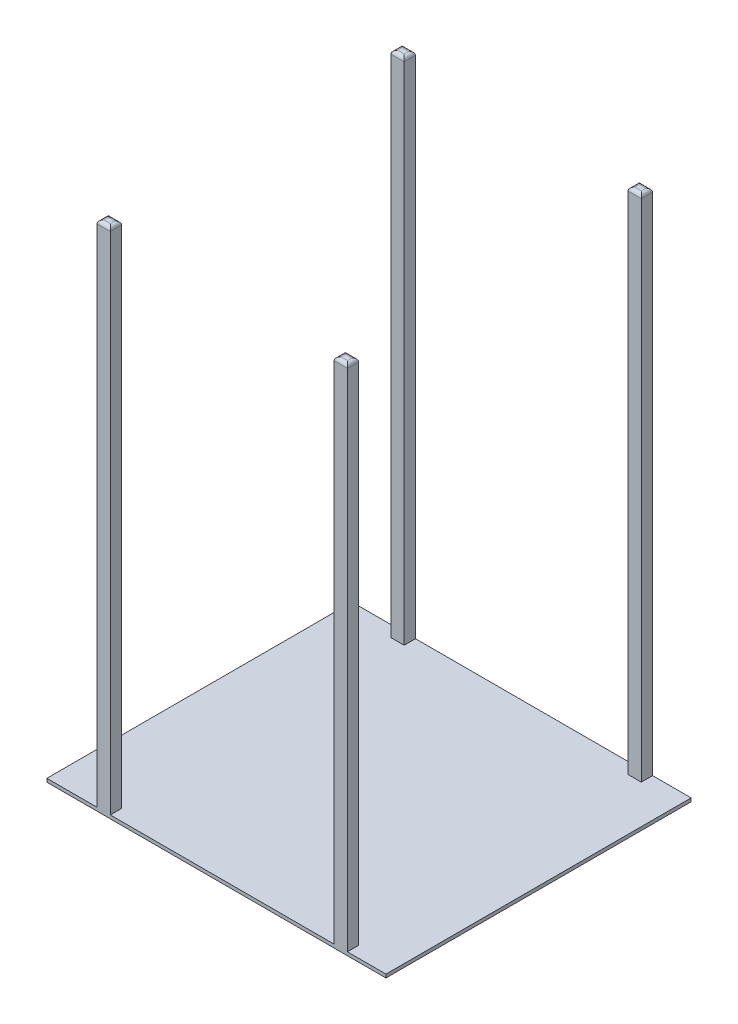
ISO-10303-21;
HEADER;
FILE_DESCRIPTION(('STEP AP214'),'2;1');
FILE_NAME('part.step','',(''),(''),'','','');
FILE_SCHEMA(('AUTOMOTIVE_DESIGN { 1 0 10303 214 1 1 1 1 }'));
ENDSEC;
DATA;
#1=APPLICATION_CONTEXT('core data for automotive mechanical design processes');
#2=APPLICATION_PROTOCOL_DEFINITION('international standard','automotive_design',2000,#1);
#3=PRODUCT_CONTEXT('',#1,'mechanical');
#4=PRODUCT('Part','Part','',(#3));
#5=PRODUCT_RELATED_PRODUCT_CATEGORY('part','',(#4));
#6=PRODUCT_DEFINITION_FORMATION('','',#4);
#7=PRODUCT_DEFINITION_CONTEXT('part definition',#1,'design');
#8=PRODUCT_DEFINITION('design','',#6,#7);
#9=PRODUCT_DEFINITION_SHAPE('','',#8);
#10=(LENGTH_UNIT() NAMED_UNIT(*) SI_UNIT(.MILLI.,.METRE.));
#11=(NAMED_UNIT(*) PLANE_ANGLE_UNIT() SI_UNIT($,.RADIAN.));
#12=(NAMED_UNIT(*) SI_UNIT($,.STERADIAN.) SOLID_ANGLE_UNIT());
#13=UNCERTAINTY_MEASURE_WITH_UNIT(LENGTH_MEASURE(1.E-05),#10,'distance_accuracy_value','');
#14=(GEOMETRIC_REPRESENTATION_CONTEXT(3) GLOBAL_UNCERTAINTY_ASSIGNED_CONTEXT((#13)) GLOBAL_UNIT_ASSIGNED_CONTEXT((#10,
#11,#12)) REPRESENTATION_CONTEXT('',''));
#15=CARTESIAN_POINT('',(0.,0.,0.));
#16=DIRECTION('',(0.,0.,1.));
#17=DIRECTION('',(1.,0.,0.));
#18=AXIS2_PLACEMENT_3D('',#15,#16,#17);
#19=CARTESIAN_POINT('',(0.,5.,0.));
#20=DIRECTION('',(0.,-1.,0.));
#21=DIRECTION('',(0.,0.,-1.));
#22=AXIS2_PLACEMENT_3D('',#19,#20,#21);
#23=PLANE('',#22);
#24=DIRECTION('',(0.,0.,1.));
#25=VECTOR('',#24,1.);
#26=CARTESIAN_POINT('',(-352.150315798933,5.,-450.));
#27=LINE('',#26,#25);
#28=CARTESIAN_POINT('',(-352.150315798933,5.,-450.));
#29=VERTEX_POINT('',#28);
#30=CARTESIAN_POINT('',(-352.150315798933,5.,-416.631011904762));
#31=VERTEX_POINT('',#30);
#32=EDGE_CURVE('E228',#29,#31,#27,.T.);
#33=ORIENTED_EDGE('',*,*,#32,.F.);
#34=DIRECTION('',(-1.,0.,0.));
#35=VECTOR('',#34,1.);
#36=CARTESIAN_POINT('',(-500.,5.,-450.));
#37=LINE('',#36,#35);
#38=CARTESIAN_POINT('',(-500.,5.,-450.));
#39=VERTEX_POINT('',#38);
#40=EDGE_CURVE('E236',#29,#39,#37,.T.);
#41=ORIENTED_EDGE('',*,*,#40,.T.);
#42=DIRECTION('',(0.,0.,1.));
#43=VECTOR('',#42,1.);
#44=CARTESIAN_POINT('',(-500.,5.,450.));
#45=LINE('',#44,#43);
#46=CARTESIAN_POINT('',(-500.,5.,450.));
#47=VERTEX_POINT('',#46);
#48=EDGE_CURVE('E312',#39,#47,#45,.T.);
#49=ORIENTED_EDGE('',*,*,#48,.T.);
#50=DIRECTION('',(1.,0.,0.));
#51=VECTOR('',#50,1.);
#52=CARTESIAN_POINT('',(-500.,5.,450.));
#53=LINE('',#52,#51);
#54=CARTESIAN_POINT('',(-352.150315798933,5.,450.));
#55=VERTEX_POINT('',#54);
#56=EDGE_CURVE('E315',#47,#55,#53,.T.);
#57=ORIENTED_EDGE('',*,*,#56,.T.);
#58=DIRECTION('',(0.,0.,1.));
#59=VECTOR('',#58,1.);
#60=CARTESIAN_POINT('',(-352.150315798933,5.,450.));
#61=LINE('',#60,#59);
#62=CARTESIAN_POINT('',(-352.150315798933,5.,416.631011904762));
#63=VERTEX_POINT('',#62);
#64=EDGE_CURVE('E290',#63,#55,#61,.T.);
#65=ORIENTED_EDGE('',*,*,#64,.F.);
#66=DIRECTION('',(-1.,0.,0.));
#67=VECTOR('',#66,1.);
#68=CARTESIAN_POINT('',(-352.150315798933,5.,416.631011904762));
#69=LINE('',#68,#67);
#70=CARTESIAN_POINT('',(-312.933324688853,5.,416.631011904762));
#71=VERTEX_POINT('',#70);
#72=EDGE_CURVE('E296',#71,#63,#69,.T.);
#73=ORIENTED_EDGE('',*,*,#72,.F.);
#74=DIRECTION('',(0.,0.,-1.));
#75=VECTOR('',#74,1.);
#76=CARTESIAN_POINT('',(-312.933324688853,5.,450.));
#77=LINE('',#76,#75);
#78=CARTESIAN_POINT('',(-312.933324688853,5.,450.));
#79=VERTEX_POINT('',#78);
#80=EDGE_CURVE('E293',#79,#71,#77,.T.);
#81=ORIENTED_EDGE('',*,*,#80,.F.);
#82=CARTESIAN_POINT('',(347.066675311147,5.,450.));
#83=VERTEX_POINT('',#82);
#84=EDGE_CURVE('E319',#79,#83,#53,.T.);
#85=ORIENTED_EDGE('',*,*,#84,.T.);
#86=DIRECTION('',(0.,0.,1.));
#87=VECTOR('',#86,1.);
#88=CARTESIAN_POINT('',(347.066675311147,5.,450.));
#89=LINE('',#88,#87);
#90=CARTESIAN_POINT('',(347.066675311147,5.,416.631011904762));
#91=VERTEX_POINT('',#90);
#92=EDGE_CURVE('E287',#91,#83,#89,.T.);
#93=ORIENTED_EDGE('',*,*,#92,.F.);
#94=DIRECTION('',(-1.,0.,0.));
#95=VECTOR('',#94,1.);
#96=CARTESIAN_POINT('',(347.066675311147,5.,416.631011904762));
#97=LINE('',#96,#95);
#98=CARTESIAN_POINT('',(386.283666421227,5.,416.631011904762));
#99=VERTEX_POINT('',#98);
#100=EDGE_CURVE('E281',#99,#91,#97,.T.);
#101=ORIENTED_EDGE('',*,*,#100,.F.);
#102=DIRECTION('',(0.,0.,-1.));
#103=VECTOR('',#102,1.);
#104=CARTESIAN_POINT('',(386.283666421227,5.,450.));
#105=LINE('',#104,#103);
#106=CARTESIAN_POINT('',(386.283666421227,5.,450.));
#107=VERTEX_POINT('',#106);
#108=EDGE_CURVE('E284',#107,#99,#105,.T.);
#109=ORIENTED_EDGE('',*,*,#108,.F.);
#110=CARTESIAN_POINT('',(500.,5.,450.));
#111=VERTEX_POINT('',#110);
#112=EDGE_CURVE('E314',#107,#111,#53,.T.);
#113=ORIENTED_EDGE('',*,*,#112,.T.);
#114=DIRECTION('',(0.,0.,-1.));
#115=VECTOR('',#114,1.);
#116=CARTESIAN_POINT('',(500.,5.,450.));
#117=LINE('',#116,#115);
#118=CARTESIAN_POINT('',(500.,5.,-450.));
#119=VERTEX_POINT('',#118);
#120=EDGE_CURVE('E244',#111,#119,#117,.T.);
#121=ORIENTED_EDGE('',*,*,#120,.T.);
#122=CARTESIAN_POINT('',(386.283666421227,5.,-450.));
#123=VERTEX_POINT('',#122);
#124=EDGE_CURVE('E246',#119,#123,#37,.T.);
#125=ORIENTED_EDGE('',*,*,#124,.T.);
#126=DIRECTION('',(0.,0.,-1.));
#127=VECTOR('',#126,1.);
#128=CARTESIAN_POINT('',(386.283666421227,5.,-450.));
#129=LINE('',#128,#127);
#130=CARTESIAN_POINT('',(386.283666421227,5.,-416.631011904762));
#131=VERTEX_POINT('',#130);
#132=EDGE_CURVE('E264',#131,#123,#129,.T.);
#133=ORIENTED_EDGE('',*,*,#132,.F.);
#134=DIRECTION('',(1.,0.,0.));
#135=VECTOR('',#134,1.);
#136=CARTESIAN_POINT('',(347.066675311147,5.,-416.631011904762));
#137=LINE('',#136,#135);
#138=CARTESIAN_POINT('',(347.066675311147,5.,-416.631011904762));
#139=VERTEX_POINT('',#138);
#140=EDGE_CURVE('E267',#139,#131,#137,.T.);
#141=ORIENTED_EDGE('',*,*,#140,.F.);
#142=DIRECTION('',(0.,0.,1.));
#143=VECTOR('',#142,1.);
#144=CARTESIAN_POINT('',(347.066675311147,5.,-450.));
#145=LINE('',#144,#143);
#146=CARTESIAN_POINT('',(347.066675311147,5.,-450.));
#147=VERTEX_POINT('',#146);
#148=EDGE_CURVE('E270',#147,#139,#145,.T.);
#149=ORIENTED_EDGE('',*,*,#148,.F.);
#150=CARTESIAN_POINT('',(-312.933324688853,5.,-450.));
#151=VERTEX_POINT('',#150);
#152=EDGE_CURVE('E243',#147,#151,#37,.T.);
#153=ORIENTED_EDGE('',*,*,#152,.T.);
#154=DIRECTION('',(0.,0.,-1.));
#155=VECTOR('',#154,1.);
#156=CARTESIAN_POINT('',(-312.933324688853,5.,-450.));
#157=LINE('',#156,#155);
#158=CARTESIAN_POINT('',(-312.933324688853,5.,-416.631011904762));
#159=VERTEX_POINT('',#158);
#160=EDGE_CURVE('E255',#159,#151,#157,.T.);
#161=ORIENTED_EDGE('',*,*,#160,.F.);
#162=DIRECTION('',(1.,0.,0.));
#163=VECTOR('',#162,1.);
#164=CARTESIAN_POINT('',(-352.150315798933,5.,-416.631011904762));
#165=LINE('',#164,#163);
#166=EDGE_CURVE('E250',#31,#159,#165,.T.);
#167=ORIENTED_EDGE('',*,*,#166,.F.);
#168=EDGE_LOOP('',(#33,#41,#49,#57,#65,#73,#81,#85,#93,#101,#109,#113,#121,#125,#133,#141,#149,
#153,#161,#167));
#169=FACE_BOUND('',#168,.T.);
#170=ADVANCED_FACE('F37',(#169),#23,.F.);
#171=CARTESIAN_POINT('',(500.,5.,450.));
#172=DIRECTION('',(-1.,0.,0.));
#173=DIRECTION('',(0.,0.,1.));
#174=AXIS2_PLACEMENT_3D('',#171,#172,#173);
#175=PLANE('',#174);
#176=DIRECTION('',(0.,0.,-1.));
#177=VECTOR('',#176,1.);
#178=CARTESIAN_POINT('',(500.,-5.,450.));
#179=LINE('',#178,#177);
#180=CARTESIAN_POINT('',(500.,-5.,450.));
#181=VERTEX_POINT('',#180);
#182=CARTESIAN_POINT('',(500.,-5.,-450.));
#183=VERTEX_POINT('',#182);
#184=EDGE_CURVE('E307',#181,#183,#179,.T.);
#185=ORIENTED_EDGE('',*,*,#184,.T.);
#186=DIRECTION('',(0.,-1.,0.));
#187=VECTOR('',#186,1.);
#188=CARTESIAN_POINT('',(500.,5.,-450.));
#189=LINE('',#188,#187);
#190=EDGE_CURVE('E333',#119,#183,#189,.T.);
#191=ORIENTED_EDGE('',*,*,#190,.F.);
#192=ORIENTED_EDGE('',*,*,#120,.F.);
#193=DIRECTION('',(0.,-1.,0.));
#194=VECTOR('',#193,1.);
#195=CARTESIAN_POINT('',(500.,5.,450.));
#196=LINE('',#195,#194);
#197=EDGE_CURVE('E318',#111,#181,#196,.T.);
#198=ORIENTED_EDGE('',*,*,#197,.T.);
#199=EDGE_LOOP('',(#185,#191,#192,#198));
#200=FACE_BOUND('',#199,.T.);
#201=ADVANCED_FACE('F477',(#200),#175,.F.);
#202=CARTESIAN_POINT('',(-500.,5.,-450.));
#203=DIRECTION('',(0.,0.,1.));
#204=DIRECTION('',(1.,0.,0.));
#205=AXIS2_PLACEMENT_3D('',#202,#203,#204);
#206=PLANE('',#205);
#207=DIRECTION('',(0.,-1.,0.));
#208=VECTOR('',#207,1.);
#209=CARTESIAN_POINT('',(347.066675311147,1505.,-450.));
#210=LINE('',#209,#208);
#211=CARTESIAN_POINT('',(347.066675311147,1495.,-450.));
#212=VERTEX_POINT('',#211);
#213=EDGE_CURVE('E251',#212,#147,#210,.T.);
#214=ORIENTED_EDGE('',*,*,#213,.F.);
#215=DIRECTION('',(-1.,0.,0.));
#216=VECTOR('',#215,1.);
#217=CARTESIAN_POINT('',(-500.,1495.,-450.));
#218=LINE('',#217,#216);
#219=CARTESIAN_POINT('',(386.283666421227,1495.,-450.));
#220=VERTEX_POINT('',#219);
#221=EDGE_CURVE('E354',#212,#220,#218,.F.);
#222=ORIENTED_EDGE('',*,*,#221,.T.);
#223=DIRECTION('',(0.,-1.,0.));
#224=VECTOR('',#223,1.);
#225=CARTESIAN_POINT('',(386.283666421227,1505.,-450.));
#226=LINE('',#225,#224);
#227=EDGE_CURVE('E262',#220,#123,#226,.T.);
#228=ORIENTED_EDGE('',*,*,#227,.T.);
#229=ORIENTED_EDGE('',*,*,#124,.F.);
#230=ORIENTED_EDGE('',*,*,#190,.T.);
#231=DIRECTION('',(-1.,0.,0.));
#232=VECTOR('',#231,1.);
#233=CARTESIAN_POINT('',(-500.,-5.,-450.));
#234=LINE('',#233,#232);
#235=CARTESIAN_POINT('',(-500.,-5.,-450.));
#236=VERTEX_POINT('',#235);
#237=EDGE_CURVE('E322',#183,#236,#234,.T.);
#238=ORIENTED_EDGE('',*,*,#237,.T.);
#239=DIRECTION('',(0.,-1.,0.));
#240=VECTOR('',#239,1.);
#241=CARTESIAN_POINT('',(-500.,5.,-450.));
#242=LINE('',#241,#240);
#243=EDGE_CURVE('E240',#39,#236,#242,.T.);
#244=ORIENTED_EDGE('',*,*,#243,.F.);
#245=ORIENTED_EDGE('',*,*,#40,.F.);
#246=DIRECTION('',(0.,-1.,0.));
#247=VECTOR('',#246,1.);
#248=CARTESIAN_POINT('',(-352.150315798933,1505.,-450.));
#249=LINE('',#248,#247);
#250=CARTESIAN_POINT('',(-352.150315798933,1495.,-450.));
#251=VERTEX_POINT('',#250);
#252=EDGE_CURVE('E224',#251,#29,#249,.T.);
#253=ORIENTED_EDGE('',*,*,#252,.F.);
#254=DIRECTION('',(-1.,0.,0.));
#255=VECTOR('',#254,1.);
#256=CARTESIAN_POINT('',(-500.,1495.,-450.));
#257=LINE('',#256,#255);
#258=CARTESIAN_POINT('',(-312.933324688853,1495.,-450.));
#259=VERTEX_POINT('',#258);
#260=EDGE_CURVE('E352',#251,#259,#257,.F.);
#261=ORIENTED_EDGE('',*,*,#260,.T.);
#262=DIRECTION('',(0.,-1.,0.));
#263=VECTOR('',#262,1.);
#264=CARTESIAN_POINT('',(-312.933324688853,1505.,-450.));
#265=LINE('',#264,#263);
#266=EDGE_CURVE('E452',#259,#151,#265,.T.);
#267=ORIENTED_EDGE('',*,*,#266,.T.);
#268=ORIENTED_EDGE('',*,*,#152,.F.);
#269=EDGE_LOOP('',(#214,#222,#228,#229,#230,#238,#244,#245,#253,#261,#267,#268));
#270=FACE_BOUND('',#269,.T.);
#271=ADVANCED_FACE('F238',(#270),#206,.F.);
#272=CARTESIAN_POINT('',(-500.,5.,450.));
#273=DIRECTION('',(1.,0.,0.));
#274=DIRECTION('',(0.,0.,-1.));
#275=AXIS2_PLACEMENT_3D('',#272,#273,#274);
#276=PLANE('',#275);
#277=DIRECTION('',(0.,0.,1.));
#278=VECTOR('',#277,1.);
#279=CARTESIAN_POINT('',(-500.,-5.,450.));
#280=LINE('',#279,#278);
#281=CARTESIAN_POINT('',(-500.,-5.,450.));
#282=VERTEX_POINT('',#281);
#283=EDGE_CURVE('E324',#236,#282,#280,.T.);
#284=ORIENTED_EDGE('',*,*,#283,.T.);
#285=DIRECTION('',(0.,-1.,0.));
#286=VECTOR('',#285,1.);
#287=CARTESIAN_POINT('',(-500.,5.,450.));
#288=LINE('',#287,#286);
#289=EDGE_CURVE('E329',#47,#282,#288,.T.);
#290=ORIENTED_EDGE('',*,*,#289,.F.);
#291=ORIENTED_EDGE('',*,*,#48,.F.);
#292=ORIENTED_EDGE('',*,*,#243,.T.);
#293=EDGE_LOOP('',(#284,#290,#291,#292));
#294=FACE_BOUND('',#293,.T.);
#295=ADVANCED_FACE('F495',(#294),#276,.F.);
#296=CARTESIAN_POINT('',(-500.,5.,450.));
#297=DIRECTION('',(0.,0.,-1.));
#298=DIRECTION('',(-1.,0.,0.));
#299=AXIS2_PLACEMENT_3D('',#296,#297,#298);
#300=PLANE('',#299);
#301=DIRECTION('',(0.,-1.,0.));
#302=VECTOR('',#301,1.);
#303=CARTESIAN_POINT('',(386.283666421227,1505.,450.));
#304=LINE('',#303,#302);
#305=CARTESIAN_POINT('',(386.283666421227,1495.,450.));
#306=VERTEX_POINT('',#305);
#307=EDGE_CURVE('E275',#306,#107,#304,.T.);
#308=ORIENTED_EDGE('',*,*,#307,.F.);
#309=DIRECTION('',(1.,0.,0.));
#310=VECTOR('',#309,1.);
#311=CARTESIAN_POINT('',(-500.,1495.,450.));
#312=LINE('',#311,#310);
#313=CARTESIAN_POINT('',(347.066675311147,1495.,450.));
#314=VERTEX_POINT('',#313);
#315=EDGE_CURVE('E372',#306,#314,#312,.F.);
#316=ORIENTED_EDGE('',*,*,#315,.T.);
#317=DIRECTION('',(0.,-1.,0.));
#318=VECTOR('',#317,1.);
#319=CARTESIAN_POINT('',(347.066675311147,1505.,450.));
#320=LINE('',#319,#318);
#321=EDGE_CURVE('E273',#314,#83,#320,.T.);
#322=ORIENTED_EDGE('',*,*,#321,.T.);
#323=ORIENTED_EDGE('',*,*,#84,.F.);
#324=DIRECTION('',(0.,-1.,0.));
#325=VECTOR('',#324,1.);
#326=CARTESIAN_POINT('',(-312.933324688853,1505.,450.));
#327=LINE('',#326,#325);
#328=CARTESIAN_POINT('',(-312.933324688853,1495.,450.));
#329=VERTEX_POINT('',#328);
#330=EDGE_CURVE('E303',#329,#79,#327,.T.);
#331=ORIENTED_EDGE('',*,*,#330,.F.);
#332=DIRECTION('',(1.,0.,0.));
#333=VECTOR('',#332,1.);
#334=CARTESIAN_POINT('',(-500.,1495.,450.));
#335=LINE('',#334,#333);
#336=CARTESIAN_POINT('',(-352.150315798933,1495.,450.));
#337=VERTEX_POINT('',#336);
#338=EDGE_CURVE('E370',#329,#337,#335,.F.);
#339=ORIENTED_EDGE('',*,*,#338,.T.);
#340=DIRECTION('',(0.,-1.,0.));
#341=VECTOR('',#340,1.);
#342=CARTESIAN_POINT('',(-352.150315798933,1505.,450.));
#343=LINE('',#342,#341);
#344=EDGE_CURVE('E305',#337,#55,#343,.T.);
#345=ORIENTED_EDGE('',*,*,#344,.T.);
#346=ORIENTED_EDGE('',*,*,#56,.F.);
#347=ORIENTED_EDGE('',*,*,#289,.T.);
#348=DIRECTION('',(1.,0.,0.));
#349=VECTOR('',#348,1.);
#350=CARTESIAN_POINT('',(-500.,-5.,450.));
#351=LINE('',#350,#349);
#352=EDGE_CURVE('E309',#282,#181,#351,.T.);
#353=ORIENTED_EDGE('',*,*,#352,.T.);
#354=ORIENTED_EDGE('',*,*,#197,.F.);
#355=ORIENTED_EDGE('',*,*,#112,.F.);
#356=EDGE_LOOP('',(#308,#316,#322,#323,#331,#339,#345,#346,#347,#353,#354,#355));
#357=FACE_BOUND('',#356,.T.);
#358=ADVANCED_FACE('F491',(#357),#300,.F.);
#359=CARTESIAN_POINT('',(0.,-5.,0.));
#360=DIRECTION('',(0.,-1.,0.));
#361=DIRECTION('',(0.,0.,-1.));
#362=AXIS2_PLACEMENT_3D('',#359,#360,#361);
#363=PLANE('',#362);
#364=ORIENTED_EDGE('',*,*,#184,.F.);
#365=ORIENTED_EDGE('',*,*,#352,.F.);
#366=ORIENTED_EDGE('',*,*,#283,.F.);
#367=ORIENTED_EDGE('',*,*,#237,.F.);
#368=EDGE_LOOP('',(#364,#365,#366,#367));
#369=FACE_BOUND('',#368,.T.);
#370=ADVANCED_FACE('F488',(#369),#363,.T.);
#371=CARTESIAN_POINT('',(-352.150315798933,1505.,450.));
#372=DIRECTION('',(1.,0.,0.));
#373=DIRECTION('',(0.,0.,-1.));
#374=AXIS2_PLACEMENT_3D('',#371,#372,#373);
#375=PLANE('',#374);
#376=ORIENTED_EDGE('',*,*,#344,.F.);
#377=DIRECTION('',(0.,0.,1.));
#378=VECTOR('',#377,1.);
#379=CARTESIAN_POINT('',(-352.150315798933,1495.,450.));
#380=LINE('',#379,#378);
#381=CARTESIAN_POINT('',(-352.150315798933,1495.,416.631011904762));
#382=VERTEX_POINT('',#381);
#383=EDGE_CURVE('E390',#337,#382,#380,.F.);
#384=ORIENTED_EDGE('',*,*,#383,.T.);
#385=DIRECTION('',(0.,-1.,0.));
#386=VECTOR('',#385,1.);
#387=CARTESIAN_POINT('',(-352.150315798933,1505.,416.631011904762));
#388=LINE('',#387,#386);
#389=EDGE_CURVE('E299',#382,#63,#388,.T.);
#390=ORIENTED_EDGE('',*,*,#389,.T.);
#391=ORIENTED_EDGE('',*,*,#64,.T.);
#392=EDGE_LOOP('',(#376,#384,#390,#391));
#393=FACE_BOUND('',#392,.T.);
#394=ADVANCED_FACE('F486',(#393),#375,.F.);
#395=CARTESIAN_POINT('',(-312.933324688853,1505.,450.));
#396=DIRECTION('',(-1.,0.,0.));
#397=DIRECTION('',(0.,0.,1.));
#398=AXIS2_PLACEMENT_3D('',#395,#396,#397);
#399=PLANE('',#398);
#400=DIRECTION('',(0.,-1.,0.));
#401=VECTOR('',#400,1.);
#402=CARTESIAN_POINT('',(-312.933324688853,1505.,416.631011904762));
#403=LINE('',#402,#401);
#404=CARTESIAN_POINT('',(-312.933324688853,1495.,416.631011904762));
#405=VERTEX_POINT('',#404);
#406=EDGE_CURVE('E301',#405,#71,#403,.T.);
#407=ORIENTED_EDGE('',*,*,#406,.F.);
#408=DIRECTION('',(0.,0.,-1.));
#409=VECTOR('',#408,1.);
#410=CARTESIAN_POINT('',(-312.933324688853,1495.,450.));
#411=LINE('',#410,#409);
#412=EDGE_CURVE('E388',#405,#329,#411,.F.);
#413=ORIENTED_EDGE('',*,*,#412,.T.);
#414=ORIENTED_EDGE('',*,*,#330,.T.);
#415=ORIENTED_EDGE('',*,*,#80,.T.);
#416=EDGE_LOOP('',(#407,#413,#414,#415));
#417=FACE_BOUND('',#416,.T.);
#418=ADVANCED_FACE('F737',(#417),#399,.F.);
#419=CARTESIAN_POINT('',(-352.150315798933,1505.,416.631011904762));
#420=DIRECTION('',(0.,0.,1.));
#421=DIRECTION('',(1.,0.,0.));
#422=AXIS2_PLACEMENT_3D('',#419,#420,#421);
#423=PLANE('',#422);
#424=ORIENTED_EDGE('',*,*,#389,.F.);
#425=DIRECTION('',(-1.,0.,0.));
#426=VECTOR('',#425,1.);
#427=CARTESIAN_POINT('',(-352.150315798933,1495.,416.631011904762));
#428=LINE('',#427,#426);
#429=EDGE_CURVE('E385',#382,#405,#428,.F.);
#430=ORIENTED_EDGE('',*,*,#429,.T.);
#431=ORIENTED_EDGE('',*,*,#406,.T.);
#432=ORIENTED_EDGE('',*,*,#72,.T.);
#433=EDGE_LOOP('',(#424,#430,#431,#432));
#434=FACE_BOUND('',#433,.T.);
#435=ADVANCED_FACE('F726',(#434),#423,.F.);
#436=CARTESIAN_POINT('',(0.,1505.,0.));
#437=DIRECTION('',(0.,-1.,0.));
#438=DIRECTION('',(0.,0.,-1.));
#439=AXIS2_PLACEMENT_3D('',#436,#437,#438);
#440=PLANE('',#439);
#441=DIRECTION('',(0.,0.,-1.));
#442=VECTOR('',#441,1.);
#443=CARTESIAN_POINT('',(-322.933324688853,1505.,0.));
#444=LINE('',#443,#442);
#445=CARTESIAN_POINT('',(-322.933324688853,1505.,440.));
#446=VERTEX_POINT('',#445);
#447=CARTESIAN_POINT('',(-322.933324688853,1505.,426.631011904762));
#448=VERTEX_POINT('',#447);
#449=EDGE_CURVE('E380',#446,#448,#444,.T.);
#450=ORIENTED_EDGE('',*,*,#449,.T.);
#451=DIRECTION('',(-1.,0.,0.));
#452=VECTOR('',#451,1.);
#453=CARTESIAN_POINT('',(0.,1505.,426.631011904762));
#454=LINE('',#453,#452);
#455=CARTESIAN_POINT('',(-342.150315798933,1505.,426.631011904762));
#456=VERTEX_POINT('',#455);
#457=EDGE_CURVE('E382',#448,#456,#454,.T.);
#458=ORIENTED_EDGE('',*,*,#457,.T.);
#459=DIRECTION('',(0.,0.,1.));
#460=VECTOR('',#459,1.);
#461=CARTESIAN_POINT('',(-342.150315798933,1505.,0.));
#462=LINE('',#461,#460);
#463=CARTESIAN_POINT('',(-342.150315798933,1505.,440.));
#464=VERTEX_POINT('',#463);
#465=EDGE_CURVE('E376',#456,#464,#462,.T.);
#466=ORIENTED_EDGE('',*,*,#465,.T.);
#467=DIRECTION('',(1.,0.,0.));
#468=VECTOR('',#467,1.);
#469=CARTESIAN_POINT('',(0.,1505.,440.));
#470=LINE('',#469,#468);
#471=EDGE_CURVE('E378',#464,#446,#470,.T.);
#472=ORIENTED_EDGE('',*,*,#471,.T.);
#473=EDGE_LOOP('',(#450,#458,#466,#472));
#474=FACE_BOUND('',#473,.T.);
#475=ADVANCED_FACE('F715',(#474),#440,.F.);
#476=CARTESIAN_POINT('',(347.066675311147,1505.,450.));
#477=DIRECTION('',(1.,0.,0.));
#478=DIRECTION('',(0.,0.,-1.));
#479=AXIS2_PLACEMENT_3D('',#476,#477,#478);
#480=PLANE('',#479);
#481=ORIENTED_EDGE('',*,*,#321,.F.);
#482=DIRECTION('',(0.,0.,1.));
#483=VECTOR('',#482,1.);
#484=CARTESIAN_POINT('',(347.066675311147,1495.,450.));
#485=LINE('',#484,#483);
#486=CARTESIAN_POINT('',(347.066675311147,1495.,416.631011904762));
#487=VERTEX_POINT('',#486);
#488=EDGE_CURVE('E374',#314,#487,#485,.F.);
#489=ORIENTED_EDGE('',*,*,#488,.T.);
#490=DIRECTION('',(0.,-1.,0.));
#491=VECTOR('',#490,1.);
#492=CARTESIAN_POINT('',(347.066675311147,1505.,416.631011904762));
#493=LINE('',#492,#491);
#494=EDGE_CURVE('E279',#487,#91,#493,.T.);
#495=ORIENTED_EDGE('',*,*,#494,.T.);
#496=ORIENTED_EDGE('',*,*,#92,.T.);
#497=EDGE_LOOP('',(#481,#489,#495,#496));
#498=FACE_BOUND('',#497,.T.);
#499=ADVANCED_FACE('F704',(#498),#480,.F.);
#500=CARTESIAN_POINT('',(386.283666421227,1505.,450.));
#501=DIRECTION('',(-1.,0.,0.));
#502=DIRECTION('',(0.,0.,1.));
#503=AXIS2_PLACEMENT_3D('',#500,#501,#502);
#504=PLANE('',#503);
#505=DIRECTION('',(0.,-1.,0.));
#506=VECTOR('',#505,1.);
#507=CARTESIAN_POINT('',(386.283666421227,1505.,416.631011904762));
#508=LINE('',#507,#506);
#509=CARTESIAN_POINT('',(386.283666421227,1495.,416.631011904762));
#510=VERTEX_POINT('',#509);
#511=EDGE_CURVE('E277',#510,#99,#508,.T.);
#512=ORIENTED_EDGE('',*,*,#511,.F.);
#513=DIRECTION('',(0.,0.,-1.));
#514=VECTOR('',#513,1.);
#515=CARTESIAN_POINT('',(386.283666421227,1495.,450.));
#516=LINE('',#515,#514);
#517=EDGE_CURVE('E368',#510,#306,#516,.F.);
#518=ORIENTED_EDGE('',*,*,#517,.T.);
#519=ORIENTED_EDGE('',*,*,#307,.T.);
#520=ORIENTED_EDGE('',*,*,#108,.T.);
#521=EDGE_LOOP('',(#512,#518,#519,#520));
#522=FACE_BOUND('',#521,.T.);
#523=ADVANCED_FACE('F693',(#522),#504,.F.);
#524=CARTESIAN_POINT('',(347.066675311147,1505.,416.631011904762));
#525=DIRECTION('',(0.,0.,1.));
#526=DIRECTION('',(1.,0.,0.));
#527=AXIS2_PLACEMENT_3D('',#524,#525,#526);
#528=PLANE('',#527);
#529=ORIENTED_EDGE('',*,*,#494,.F.);
#530=DIRECTION('',(-1.,0.,0.));
#531=VECTOR('',#530,1.);
#532=CARTESIAN_POINT('',(347.066675311147,1495.,416.631011904762));
#533=LINE('',#532,#531);
#534=EDGE_CURVE('E365',#487,#510,#533,.F.);
#535=ORIENTED_EDGE('',*,*,#534,.T.);
#536=ORIENTED_EDGE('',*,*,#511,.T.);
#537=ORIENTED_EDGE('',*,*,#100,.T.);
#538=EDGE_LOOP('',(#529,#535,#536,#537));
#539=FACE_BOUND('',#538,.T.);
#540=ADVANCED_FACE('F682',(#539),#528,.F.);
#541=CARTESIAN_POINT('',(0.,1505.,0.));
#542=DIRECTION('',(0.,-1.,0.));
#543=DIRECTION('',(0.,0.,-1.));
#544=AXIS2_PLACEMENT_3D('',#541,#542,#543);
#545=PLANE('',#544);
#546=DIRECTION('',(0.,0.,-1.));
#547=VECTOR('',#546,1.);
#548=CARTESIAN_POINT('',(376.283666421227,1505.,0.));
#549=LINE('',#548,#547);
#550=CARTESIAN_POINT('',(376.283666421227,1505.,440.));
#551=VERTEX_POINT('',#550);
#552=CARTESIAN_POINT('',(376.283666421227,1505.,426.631011904762));
#553=VERTEX_POINT('',#552);
#554=EDGE_CURVE('E360',#551,#553,#549,.T.);
#555=ORIENTED_EDGE('',*,*,#554,.T.);
#556=DIRECTION('',(-1.,0.,0.));
#557=VECTOR('',#556,1.);
#558=CARTESIAN_POINT('',(0.,1505.,426.631011904762));
#559=LINE('',#558,#557);
#560=CARTESIAN_POINT('',(357.066675311147,1505.,426.631011904762));
#561=VERTEX_POINT('',#560);
#562=EDGE_CURVE('E362',#553,#561,#559,.T.);
#563=ORIENTED_EDGE('',*,*,#562,.T.);
#564=DIRECTION('',(0.,0.,1.));
#565=VECTOR('',#564,1.);
#566=CARTESIAN_POINT('',(357.066675311147,1505.,0.));
#567=LINE('',#566,#565);
#568=CARTESIAN_POINT('',(357.066675311147,1505.,440.));
#569=VERTEX_POINT('',#568);
#570=EDGE_CURVE('E356',#561,#569,#567,.T.);
#571=ORIENTED_EDGE('',*,*,#570,.T.);
#572=DIRECTION('',(1.,0.,0.));
#573=VECTOR('',#572,1.);
#574=CARTESIAN_POINT('',(0.,1505.,440.));
#575=LINE('',#574,#573);
#576=EDGE_CURVE('E358',#569,#551,#575,.T.);
#577=ORIENTED_EDGE('',*,*,#576,.T.);
#578=EDGE_LOOP('',(#555,#563,#571,#577));
#579=FACE_BOUND('',#578,.T.);
#580=ADVANCED_FACE('F672',(#579),#545,.F.);
#581=CARTESIAN_POINT('',(347.066675311147,1505.,-450.));
#582=DIRECTION('',(1.,0.,0.));
#583=DIRECTION('',(0.,0.,-1.));
#584=AXIS2_PLACEMENT_3D('',#581,#582,#583);
#585=PLANE('',#584);
#586=DIRECTION('',(0.,-1.,0.));
#587=VECTOR('',#586,1.);
#588=CARTESIAN_POINT('',(347.066675311147,1505.,-416.631011904762));
#589=LINE('',#588,#587);
#590=CARTESIAN_POINT('',(347.066675311147,1495.,-416.631011904762));
#591=VERTEX_POINT('',#590);
#592=EDGE_CURVE('E253',#591,#139,#589,.T.);
#593=ORIENTED_EDGE('',*,*,#592,.F.);
#594=DIRECTION('',(0.,0.,1.));
#595=VECTOR('',#594,1.);
#596=CARTESIAN_POINT('',(347.066675311147,1495.,-450.));
#597=LINE('',#596,#595);
#598=EDGE_CURVE('E350',#591,#212,#597,.F.);
#599=ORIENTED_EDGE('',*,*,#598,.T.);
#600=ORIENTED_EDGE('',*,*,#213,.T.);
#601=ORIENTED_EDGE('',*,*,#148,.T.);
#602=EDGE_LOOP('',(#593,#599,#600,#601));
#603=FACE_BOUND('',#602,.T.);
#604=ADVANCED_FACE('F661',(#603),#585,.F.);
#605=CARTESIAN_POINT('',(347.066675311147,1505.,-416.631011904762));
#606=DIRECTION('',(0.,0.,-1.));
#607=DIRECTION('',(-1.,0.,0.));
#608=AXIS2_PLACEMENT_3D('',#605,#606,#607);
#609=PLANE('',#608);
#610=DIRECTION('',(0.,-1.,0.));
#611=VECTOR('',#610,1.);
#612=CARTESIAN_POINT('',(386.283666421227,1505.,-416.631011904762));
#613=LINE('',#612,#611);
#614=CARTESIAN_POINT('',(386.283666421227,1495.,-416.631011904762));
#615=VERTEX_POINT('',#614);
#616=EDGE_CURVE('E260',#615,#131,#613,.T.);
#617=ORIENTED_EDGE('',*,*,#616,.F.);
#618=DIRECTION('',(1.,0.,0.));
#619=VECTOR('',#618,1.);
#620=CARTESIAN_POINT('',(347.066675311147,1495.,-416.631011904762));
#621=LINE('',#620,#619);
#622=EDGE_CURVE('E348',#615,#591,#621,.F.);
#623=ORIENTED_EDGE('',*,*,#622,.T.);
#624=ORIENTED_EDGE('',*,*,#592,.T.);
#625=ORIENTED_EDGE('',*,*,#140,.T.);
#626=EDGE_LOOP('',(#617,#623,#624,#625));
#627=FACE_BOUND('',#626,.T.);
#628=ADVANCED_FACE('F650',(#627),#609,.F.);
#629=CARTESIAN_POINT('',(386.283666421227,1505.,-450.));
#630=DIRECTION('',(-1.,0.,0.));
#631=DIRECTION('',(0.,0.,1.));
#632=AXIS2_PLACEMENT_3D('',#629,#630,#631);
#633=PLANE('',#632);
#634=ORIENTED_EDGE('',*,*,#227,.F.);
#635=DIRECTION('',(0.,0.,-1.));
#636=VECTOR('',#635,1.);
#637=CARTESIAN_POINT('',(386.283666421227,1495.,-450.));
#638=LINE('',#637,#636);
#639=EDGE_CURVE('E345',#220,#615,#638,.F.);
#640=ORIENTED_EDGE('',*,*,#639,.T.);
#641=ORIENTED_EDGE('',*,*,#616,.T.);
#642=ORIENTED_EDGE('',*,*,#132,.T.);
#643=EDGE_LOOP('',(#634,#640,#641,#642));
#644=FACE_BOUND('',#643,.T.);
#645=ADVANCED_FACE('F639',(#644),#633,.F.);
#646=CARTESIAN_POINT('',(0.,1505.,0.));
#647=DIRECTION('',(0.,-1.,0.));
#648=DIRECTION('',(0.,0.,-1.));
#649=AXIS2_PLACEMENT_3D('',#646,#647,#648);
#650=PLANE('',#649);
#651=DIRECTION('',(1.,0.,0.));
#652=VECTOR('',#651,1.);
#653=CARTESIAN_POINT('',(0.,1505.,-426.631011904762));
#654=LINE('',#653,#652);
#655=CARTESIAN_POINT('',(357.066675311147,1505.,-426.631011904762));
#656=VERTEX_POINT('',#655);
#657=CARTESIAN_POINT('',(376.283666421227,1505.,-426.631011904762));
#658=VERTEX_POINT('',#657);
#659=EDGE_CURVE('E340',#656,#658,#654,.T.);
#660=ORIENTED_EDGE('',*,*,#659,.T.);
#661=DIRECTION('',(0.,0.,-1.));
#662=VECTOR('',#661,1.);
#663=CARTESIAN_POINT('',(376.283666421227,1505.,0.));
#664=LINE('',#663,#662);
#665=CARTESIAN_POINT('',(376.283666421227,1505.,-440.));
#666=VERTEX_POINT('',#665);
#667=EDGE_CURVE('E342',#658,#666,#664,.T.);
#668=ORIENTED_EDGE('',*,*,#667,.T.);
#669=DIRECTION('',(-1.,0.,0.));
#670=VECTOR('',#669,1.);
#671=CARTESIAN_POINT('',(0.,1505.,-440.));
#672=LINE('',#671,#670);
#673=CARTESIAN_POINT('',(357.066675311147,1505.,-440.));
#674=VERTEX_POINT('',#673);
#675=EDGE_CURVE('E336',#666,#674,#672,.T.);
#676=ORIENTED_EDGE('',*,*,#675,.T.);
#677=DIRECTION('',(0.,0.,1.));
#678=VECTOR('',#677,1.);
#679=CARTESIAN_POINT('',(357.066675311147,1505.,0.));
#680=LINE('',#679,#678);
#681=EDGE_CURVE('E338',#674,#656,#680,.T.);
#682=ORIENTED_EDGE('',*,*,#681,.T.);
#683=EDGE_LOOP('',(#660,#668,#676,#682));
#684=FACE_BOUND('',#683,.T.);
#685=ADVANCED_FACE('F629',(#684),#650,.F.);
#686=CARTESIAN_POINT('',(-352.150315798933,1505.,-450.));
#687=DIRECTION('',(1.,0.,0.));
#688=DIRECTION('',(0.,0.,-1.));
#689=AXIS2_PLACEMENT_3D('',#686,#687,#688);
#690=PLANE('',#689);
#691=DIRECTION('',(0.,-1.,0.));
#692=VECTOR('',#691,1.);
#693=CARTESIAN_POINT('',(-352.150315798933,1505.,-416.631011904762));
#694=LINE('',#693,#692);
#695=CARTESIAN_POINT('',(-352.150315798933,1495.,-416.631011904762));
#696=VERTEX_POINT('',#695);
#697=EDGE_CURVE('E232',#696,#31,#694,.T.);
#698=ORIENTED_EDGE('',*,*,#697,.F.);
#699=DIRECTION('',(0.,0.,1.));
#700=VECTOR('',#699,1.);
#701=CARTESIAN_POINT('',(-352.150315798933,1495.,-450.));
#702=LINE('',#701,#700);
#703=EDGE_CURVE('E11',#696,#251,#702,.F.);
#704=ORIENTED_EDGE('',*,*,#703,.T.);
#705=ORIENTED_EDGE('',*,*,#252,.T.);
#706=ORIENTED_EDGE('',*,*,#32,.T.);
#707=EDGE_LOOP('',(#698,#704,#705,#706));
#708=FACE_BOUND('',#707,.T.);
#709=ADVANCED_FACE('F226',(#708),#690,.F.);
#710=CARTESIAN_POINT('',(-352.150315798933,1505.,-416.631011904762));
#711=DIRECTION('',(0.,0.,-1.));
#712=DIRECTION('',(-1.,0.,0.));
#713=AXIS2_PLACEMENT_3D('',#710,#711,#712);
#714=PLANE('',#713);
#715=DIRECTION('',(0.,-1.,0.));
#716=VECTOR('',#715,1.);
#717=CARTESIAN_POINT('',(-312.933324688853,1505.,-416.631011904762));
#718=LINE('',#717,#716);
#719=CARTESIAN_POINT('',(-312.933324688853,1495.,-416.631011904762));
#720=VERTEX_POINT('',#719);
#721=EDGE_CURVE('E457',#720,#159,#718,.T.);
#722=ORIENTED_EDGE('',*,*,#721,.F.);
#723=DIRECTION('',(1.,0.,0.));
#724=VECTOR('',#723,1.);
#725=CARTESIAN_POINT('',(-352.150315798933,1495.,-416.631011904762));
#726=LINE('',#725,#724);
#727=EDGE_CURVE('E46',#720,#696,#726,.F.);
#728=ORIENTED_EDGE('',*,*,#727,.T.);
#729=ORIENTED_EDGE('',*,*,#697,.T.);
#730=ORIENTED_EDGE('',*,*,#166,.T.);
#731=EDGE_LOOP('',(#722,#728,#729,#730));
#732=FACE_BOUND('',#731,.T.);
#733=ADVANCED_FACE('F473',(#732),#714,.F.);
#734=CARTESIAN_POINT('',(-312.933324688853,1505.,-450.));
#735=DIRECTION('',(-1.,0.,0.));
#736=DIRECTION('',(0.,0.,1.));
#737=AXIS2_PLACEMENT_3D('',#734,#735,#736);
#738=PLANE('',#737);
#739=ORIENTED_EDGE('',*,*,#266,.F.);
#740=DIRECTION('',(0.,0.,-1.));
#741=VECTOR('',#740,1.);
#742=CARTESIAN_POINT('',(-312.933324688853,1495.,-450.));
#743=LINE('',#742,#741);
#744=EDGE_CURVE('E401',#259,#720,#743,.F.);
#745=ORIENTED_EDGE('',*,*,#744,.T.);
#746=ORIENTED_EDGE('',*,*,#721,.T.);
#747=ORIENTED_EDGE('',*,*,#160,.T.);
#748=EDGE_LOOP('',(#739,#745,#746,#747));
#749=FACE_BOUND('',#748,.T.);
#750=ADVANCED_FACE('F456',(#749),#738,.F.);
#751=CARTESIAN_POINT('',(0.,1505.,0.));
#752=DIRECTION('',(0.,-1.,0.));
#753=DIRECTION('',(0.,0.,-1.));
#754=AXIS2_PLACEMENT_3D('',#751,#752,#753);
#755=PLANE('',#754);
#756=DIRECTION('',(1.,0.,0.));
#757=VECTOR('',#756,1.);
#758=CARTESIAN_POINT('',(0.,1505.,-426.631011904762));
#759=LINE('',#758,#757);
#760=CARTESIAN_POINT('',(-342.150315798933,1505.,-426.631011904762));
#761=VERTEX_POINT('',#760);
#762=CARTESIAN_POINT('',(-322.933324688853,1505.,-426.631011904762));
#763=VERTEX_POINT('',#762);
#764=EDGE_CURVE('E396',#761,#763,#759,.T.);
#765=ORIENTED_EDGE('',*,*,#764,.T.);
#766=DIRECTION('',(0.,0.,-1.));
#767=VECTOR('',#766,1.);
#768=CARTESIAN_POINT('',(-322.933324688853,1505.,0.));
#769=LINE('',#768,#767);
#770=CARTESIAN_POINT('',(-322.933324688853,1505.,-440.));
#771=VERTEX_POINT('',#770);
#772=EDGE_CURVE('E398',#763,#771,#769,.T.);
#773=ORIENTED_EDGE('',*,*,#772,.T.);
#774=DIRECTION('',(-1.,0.,0.));
#775=VECTOR('',#774,1.);
#776=CARTESIAN_POINT('',(0.,1505.,-440.));
#777=LINE('',#776,#775);
#778=CARTESIAN_POINT('',(-342.150315798933,1505.,-440.));
#779=VERTEX_POINT('',#778);
#780=EDGE_CURVE('E392',#771,#779,#777,.T.);
#781=ORIENTED_EDGE('',*,*,#780,.T.);
#782=DIRECTION('',(0.,0.,1.));
#783=VECTOR('',#782,1.);
#784=CARTESIAN_POINT('',(-342.150315798933,1505.,0.));
#785=LINE('',#784,#783);
#786=EDGE_CURVE('E394',#779,#761,#785,.T.);
#787=ORIENTED_EDGE('',*,*,#786,.T.);
#788=EDGE_LOOP('',(#765,#773,#781,#787));
#789=FACE_BOUND('',#788,.T.);
#790=ADVANCED_FACE('F461',(#789),#755,.F.);
#791=CARTESIAN_POINT('',(357.066675311147,1495.,0.));
#792=DIRECTION('',(0.,0.,1.));
#793=DIRECTION('',(1.,0.,0.));
#794=AXIS2_PLACEMENT_3D('',#791,#792,#793);
#795=CYLINDRICAL_SURFACE('',#794,10.);
#796=CARTESIAN_POINT('',(357.066675311147,1495.,-440.));
#797=DIRECTION('',(-0.707106781186547,0.,0.707106781186547));
#798=DIRECTION('',(-0.707106781186547,0.,-0.707106781186547));
#799=AXIS2_PLACEMENT_3D('',#796,#797,#798);
#800=ELLIPSE('',#799,14.1421356237309,10.);
#801=EDGE_CURVE('E410',#212,#674,#800,.F.);
#802=ORIENTED_EDGE('',*,*,#801,.F.);
#803=ORIENTED_EDGE('',*,*,#598,.F.);
#804=CARTESIAN_POINT('',(357.066675311147,1495.,-426.631011904762));
#805=DIRECTION('',(0.707106781186547,0.,0.707106781186547));
#806=DIRECTION('',(-0.707106781186547,0.,0.707106781186547));
#807=AXIS2_PLACEMENT_3D('',#804,#805,#806);
#808=ELLIPSE('',#807,14.1421356237309,10.);
#809=EDGE_CURVE('E233',#656,#591,#808,.T.);
#810=ORIENTED_EDGE('',*,*,#809,.F.);
#811=ORIENTED_EDGE('',*,*,#681,.F.);
#812=EDGE_LOOP('',(#802,#803,#810,#811));
#813=FACE_BOUND('',#812,.T.);
#814=ADVANCED_FACE('F463',(#813),#795,.T.);
#815=CARTESIAN_POINT('',(0.,1495.,-426.631011904762));
#816=DIRECTION('',(1.,0.,0.));
#817=DIRECTION('',(0.,0.,-1.));
#818=AXIS2_PLACEMENT_3D('',#815,#816,#817);
#819=CYLINDRICAL_SURFACE('',#818,10.);
#820=ORIENTED_EDGE('',*,*,#809,.T.);
#821=ORIENTED_EDGE('',*,*,#622,.F.);
#822=CARTESIAN_POINT('',(376.283666421227,1495.,-426.631011904762));
#823=DIRECTION('',(0.707106781186547,0.,-0.707106781186547));
#824=DIRECTION('',(0.707106781186547,0.,0.707106781186547));
#825=AXIS2_PLACEMENT_3D('',#822,#823,#824);
#826=ELLIPSE('',#825,14.1421356237309,10.);
#827=EDGE_CURVE('E407',#658,#615,#826,.T.);
#828=ORIENTED_EDGE('',*,*,#827,.F.);
#829=ORIENTED_EDGE('',*,*,#659,.F.);
#830=EDGE_LOOP('',(#820,#821,#828,#829));
#831=FACE_BOUND('',#830,.T.);
#832=ADVANCED_FACE('F470',(#831),#819,.T.);
#833=CARTESIAN_POINT('',(0.,1495.,-440.));
#834=DIRECTION('',(-1.,0.,0.));
#835=DIRECTION('',(0.,0.,1.));
#836=AXIS2_PLACEMENT_3D('',#833,#834,#835);
#837=CYLINDRICAL_SURFACE('',#836,10.);
#838=ORIENTED_EDGE('',*,*,#801,.T.);
#839=ORIENTED_EDGE('',*,*,#675,.F.);
#840=CARTESIAN_POINT('',(376.283666421227,1495.,-440.));
#841=DIRECTION('',(-0.707106781186547,0.,-0.707106781186547));
#842=DIRECTION('',(-0.707106781186547,0.,0.707106781186547));
#843=AXIS2_PLACEMENT_3D('',#840,#841,#842);
#844=ELLIPSE('',#843,14.1421356237309,10.);
#845=EDGE_CURVE('E405',#220,#666,#844,.F.);
#846=ORIENTED_EDGE('',*,*,#845,.F.);
#847=ORIENTED_EDGE('',*,*,#221,.F.);
#848=EDGE_LOOP('',(#838,#839,#846,#847));
#849=FACE_BOUND('',#848,.T.);
#850=ADVANCED_FACE('F506',(#849),#837,.T.);
#851=CARTESIAN_POINT('',(376.283666421227,1495.,0.));
#852=DIRECTION('',(0.,0.,-1.));
#853=DIRECTION('',(-1.,0.,0.));
#854=AXIS2_PLACEMENT_3D('',#851,#852,#853);
#855=CYLINDRICAL_SURFACE('',#854,10.);
#856=ORIENTED_EDGE('',*,*,#827,.T.);
#857=ORIENTED_EDGE('',*,*,#639,.F.);
#858=ORIENTED_EDGE('',*,*,#845,.T.);
#859=ORIENTED_EDGE('',*,*,#667,.F.);
#860=EDGE_LOOP('',(#856,#857,#858,#859));
#861=FACE_BOUND('',#860,.T.);
#862=ADVANCED_FACE('F502',(#861),#855,.T.);
#863=CARTESIAN_POINT('',(0.,1495.,440.));
#864=DIRECTION('',(1.,0.,0.));
#865=DIRECTION('',(0.,0.,-1.));
#866=AXIS2_PLACEMENT_3D('',#863,#864,#865);
#867=CYLINDRICAL_SURFACE('',#866,10.);
#868=CARTESIAN_POINT('',(357.066675311147,1495.,440.));
#869=DIRECTION('',(0.707106781186547,0.,0.707106781186547));
#870=DIRECTION('',(-0.707106781186547,0.,0.707106781186547));
#871=AXIS2_PLACEMENT_3D('',#868,#869,#870);
#872=ELLIPSE('',#871,14.1421356237309,10.);
#873=EDGE_CURVE('E420',#314,#569,#872,.F.);
#874=ORIENTED_EDGE('',*,*,#873,.F.);
#875=ORIENTED_EDGE('',*,*,#315,.F.);
#876=CARTESIAN_POINT('',(376.283666421227,1495.,440.));
#877=DIRECTION('',(0.707106781186547,0.,-0.707106781186547));
#878=DIRECTION('',(0.707106781186547,0.,0.707106781186547));
#879=AXIS2_PLACEMENT_3D('',#876,#877,#878);
#880=ELLIPSE('',#879,14.1421356237309,10.);
#881=EDGE_CURVE('E408',#551,#306,#880,.T.);
#882=ORIENTED_EDGE('',*,*,#881,.F.);
#883=ORIENTED_EDGE('',*,*,#576,.F.);
#884=EDGE_LOOP('',(#874,#875,#882,#883));
#885=FACE_BOUND('',#884,.T.);
#886=ADVANCED_FACE('F505',(#885),#867,.T.);
#887=CARTESIAN_POINT('',(376.283666421227,1495.,0.));
#888=DIRECTION('',(0.,0.,-1.));
#889=DIRECTION('',(-1.,0.,0.));
#890=AXIS2_PLACEMENT_3D('',#887,#888,#889);
#891=CYLINDRICAL_SURFACE('',#890,10.);
#892=ORIENTED_EDGE('',*,*,#881,.T.);
#893=ORIENTED_EDGE('',*,*,#517,.F.);
#894=CARTESIAN_POINT('',(376.283666421227,1495.,426.631011904762));
#895=DIRECTION('',(-0.707106781186547,0.,-0.707106781186547));
#896=DIRECTION('',(0.707106781186547,0.,-0.707106781186547));
#897=AXIS2_PLACEMENT_3D('',#894,#895,#896);
#898=ELLIPSE('',#897,14.1421356237309,10.);
#899=EDGE_CURVE('E417',#553,#510,#898,.T.);
#900=ORIENTED_EDGE('',*,*,#899,.F.);
#901=ORIENTED_EDGE('',*,*,#554,.F.);
#902=EDGE_LOOP('',(#892,#893,#900,#901));
#903=FACE_BOUND('',#902,.T.);
#904=ADVANCED_FACE('F522',(#903),#891,.T.);
#905=CARTESIAN_POINT('',(357.066675311147,1495.,0.));
#906=DIRECTION('',(0.,0.,1.));
#907=DIRECTION('',(1.,0.,0.));
#908=AXIS2_PLACEMENT_3D('',#905,#906,#907);
#909=CYLINDRICAL_SURFACE('',#908,10.);
#910=ORIENTED_EDGE('',*,*,#873,.T.);
#911=ORIENTED_EDGE('',*,*,#570,.F.);
#912=CARTESIAN_POINT('',(357.066675311147,1495.,426.631011904762));
#913=DIRECTION('',(-0.707106781186547,0.,0.707106781186547));
#914=DIRECTION('',(0.707106781186547,0.,0.707106781186547));
#915=AXIS2_PLACEMENT_3D('',#912,#913,#914);
#916=ELLIPSE('',#915,14.1421356237309,10.);
#917=EDGE_CURVE('E415',#487,#561,#916,.F.);
#918=ORIENTED_EDGE('',*,*,#917,.F.);
#919=ORIENTED_EDGE('',*,*,#488,.F.);
#920=EDGE_LOOP('',(#910,#911,#918,#919));
#921=FACE_BOUND('',#920,.T.);
#922=ADVANCED_FACE('F518',(#921),#909,.T.);
#923=CARTESIAN_POINT('',(0.,1495.,426.631011904762));
#924=DIRECTION('',(-1.,0.,0.));
#925=DIRECTION('',(0.,0.,1.));
#926=AXIS2_PLACEMENT_3D('',#923,#924,#925);
#927=CYLINDRICAL_SURFACE('',#926,10.);
#928=ORIENTED_EDGE('',*,*,#899,.T.);
#929=ORIENTED_EDGE('',*,*,#534,.F.);
#930=ORIENTED_EDGE('',*,*,#917,.T.);
#931=ORIENTED_EDGE('',*,*,#562,.F.);
#932=EDGE_LOOP('',(#928,#929,#930,#931));
#933=FACE_BOUND('',#932,.T.);
#934=ADVANCED_FACE('F514',(#933),#927,.T.);
#935=CARTESIAN_POINT('',(0.,1495.,440.));
#936=DIRECTION('',(1.,0.,0.));
#937=DIRECTION('',(0.,0.,-1.));
#938=AXIS2_PLACEMENT_3D('',#935,#936,#937);
#939=CYLINDRICAL_SURFACE('',#938,10.);
#940=CARTESIAN_POINT('',(-342.150315798933,1495.,440.));
#941=DIRECTION('',(0.707106781186547,0.,0.707106781186547));
#942=DIRECTION('',(-0.707106781186547,0.,0.707106781186547));
#943=AXIS2_PLACEMENT_3D('',#940,#941,#942);
#944=ELLIPSE('',#943,14.1421356237309,10.);
#945=EDGE_CURVE('E429',#337,#464,#944,.F.);
#946=ORIENTED_EDGE('',*,*,#945,.F.);
#947=ORIENTED_EDGE('',*,*,#338,.F.);
#948=CARTESIAN_POINT('',(-322.933324688853,1495.,440.));
#949=DIRECTION('',(0.707106781186547,0.,-0.707106781186547));
#950=DIRECTION('',(0.707106781186547,0.,0.707106781186547));
#951=AXIS2_PLACEMENT_3D('',#948,#949,#950);
#952=ELLIPSE('',#951,14.1421356237309,10.);
#953=EDGE_CURVE('E418',#446,#329,#952,.T.);
#954=ORIENTED_EDGE('',*,*,#953,.F.);
#955=ORIENTED_EDGE('',*,*,#471,.F.);
#956=EDGE_LOOP('',(#946,#947,#954,#955));
#957=FACE_BOUND('',#956,.T.);
#958=ADVANCED_FACE('F517',(#957),#939,.T.);
#959=CARTESIAN_POINT('',(-322.933324688853,1495.,0.));
#960=DIRECTION('',(0.,0.,-1.));
#961=DIRECTION('',(-1.,0.,0.));
#962=AXIS2_PLACEMENT_3D('',#959,#960,#961);
#963=CYLINDRICAL_SURFACE('',#962,10.);
#964=ORIENTED_EDGE('',*,*,#953,.T.);
#965=ORIENTED_EDGE('',*,*,#412,.F.);
#966=CARTESIAN_POINT('',(-322.933324688853,1495.,426.631011904762));
#967=DIRECTION('',(-0.707106781186547,0.,-0.707106781186547));
#968=DIRECTION('',(0.707106781186547,0.,-0.707106781186547));
#969=AXIS2_PLACEMENT_3D('',#966,#967,#968);
#970=ELLIPSE('',#969,14.1421356237309,10.);
#971=EDGE_CURVE('E427',#448,#405,#970,.T.);
#972=ORIENTED_EDGE('',*,*,#971,.F.);
#973=ORIENTED_EDGE('',*,*,#449,.F.);
#974=EDGE_LOOP('',(#964,#965,#972,#973));
#975=FACE_BOUND('',#974,.T.);
#976=ADVANCED_FACE('F537',(#975),#963,.T.);
#977=CARTESIAN_POINT('',(-342.150315798933,1495.,0.));
#978=DIRECTION('',(0.,0.,1.));
#979=DIRECTION('',(1.,0.,0.));
#980=AXIS2_PLACEMENT_3D('',#977,#978,#979);
#981=CYLINDRICAL_SURFACE('',#980,10.);
#982=ORIENTED_EDGE('',*,*,#945,.T.);
#983=ORIENTED_EDGE('',*,*,#465,.F.);
#984=CARTESIAN_POINT('',(-342.150315798933,1495.,426.631011904762));
#985=DIRECTION('',(-0.707106781186547,0.,0.707106781186547));
#986=DIRECTION('',(0.707106781186547,0.,0.707106781186547));
#987=AXIS2_PLACEMENT_3D('',#984,#985,#986);
#988=ELLIPSE('',#987,14.1421356237309,10.);
#989=EDGE_CURVE('E425',#382,#456,#988,.F.);
#990=ORIENTED_EDGE('',*,*,#989,.F.);
#991=ORIENTED_EDGE('',*,*,#383,.F.);
#992=EDGE_LOOP('',(#982,#983,#990,#991));
#993=FACE_BOUND('',#992,.T.);
#994=ADVANCED_FACE('F533',(#993),#981,.T.);
#995=CARTESIAN_POINT('',(0.,1495.,426.631011904762));
#996=DIRECTION('',(-1.,0.,0.));
#997=DIRECTION('',(0.,0.,1.));
#998=AXIS2_PLACEMENT_3D('',#995,#996,#997);
#999=CYLINDRICAL_SURFACE('',#998,10.);
#1000=ORIENTED_EDGE('',*,*,#971,.T.);
#1001=ORIENTED_EDGE('',*,*,#429,.F.);
#1002=ORIENTED_EDGE('',*,*,#989,.T.);
#1003=ORIENTED_EDGE('',*,*,#457,.F.);
#1004=EDGE_LOOP('',(#1000,#1001,#1002,#1003));
#1005=FACE_BOUND('',#1004,.T.);
#1006=ADVANCED_FACE('F530',(#1005),#999,.T.);
#1007=CARTESIAN_POINT('',(-342.150315798933,1495.,0.));
#1008=DIRECTION('',(0.,0.,1.));
#1009=DIRECTION('',(1.,0.,0.));
#1010=AXIS2_PLACEMENT_3D('',#1007,#1008,#1009);
#1011=CYLINDRICAL_SURFACE('',#1010,10.);
#1012=CARTESIAN_POINT('',(-342.150315798933,1495.,-440.));
#1013=DIRECTION('',(-0.707106781186547,0.,0.707106781186547));
#1014=DIRECTION('',(-0.707106781186547,0.,-0.707106781186547));
#1015=AXIS2_PLACEMENT_3D('',#1012,#1013,#1014);
#1016=ELLIPSE('',#1015,14.1421356237309,10.);
#1017=EDGE_CURVE('E436',#251,#779,#1016,.F.);
#1018=ORIENTED_EDGE('',*,*,#1017,.F.);
#1019=ORIENTED_EDGE('',*,*,#703,.F.);
#1020=CARTESIAN_POINT('',(-342.150315798933,1495.,-426.631011904762));
#1021=DIRECTION('',(0.707106781186547,0.,0.707106781186547));
#1022=DIRECTION('',(-0.707106781186547,0.,0.707106781186547));
#1023=AXIS2_PLACEMENT_3D('',#1020,#1021,#1022);
#1024=ELLIPSE('',#1023,14.1421356237309,10.);
#1025=EDGE_CURVE('E41',#761,#696,#1024,.T.);
#1026=ORIENTED_EDGE('',*,*,#1025,.F.);
#1027=ORIENTED_EDGE('',*,*,#786,.F.);
#1028=EDGE_LOOP('',(#1018,#1019,#1026,#1027));
#1029=FACE_BOUND('',#1028,.T.);
#1030=ADVANCED_FACE('F39',(#1029),#1011,.T.);
#1031=CARTESIAN_POINT('',(0.,1495.,-426.631011904762));
#1032=DIRECTION('',(1.,0.,0.));
#1033=DIRECTION('',(0.,0.,-1.));
#1034=AXIS2_PLACEMENT_3D('',#1031,#1032,#1033);
#1035=CYLINDRICAL_SURFACE('',#1034,10.);
#1036=ORIENTED_EDGE('',*,*,#1025,.T.);
#1037=ORIENTED_EDGE('',*,*,#727,.F.);
#1038=CARTESIAN_POINT('',(-322.933324688853,1495.,-426.631011904762));
#1039=DIRECTION('',(0.707106781186547,0.,-0.707106781186547));
#1040=DIRECTION('',(0.707106781186547,0.,0.707106781186547));
#1041=AXIS2_PLACEMENT_3D('',#1038,#1039,#1040);
#1042=ELLIPSE('',#1041,14.1421356237309,10.);
#1043=EDGE_CURVE('E61',#763,#720,#1042,.T.);
#1044=ORIENTED_EDGE('',*,*,#1043,.F.);
#1045=ORIENTED_EDGE('',*,*,#764,.F.);
#1046=EDGE_LOOP('',(#1036,#1037,#1044,#1045));
#1047=FACE_BOUND('',#1046,.T.);
#1048=ADVANCED_FACE('F445',(#1047),#1035,.T.);
#1049=CARTESIAN_POINT('',(0.,1495.,-440.));
#1050=DIRECTION('',(-1.,0.,0.));
#1051=DIRECTION('',(0.,0.,1.));
#1052=AXIS2_PLACEMENT_3D('',#1049,#1050,#1051);
#1053=CYLINDRICAL_SURFACE('',#1052,10.);
#1054=ORIENTED_EDGE('',*,*,#1017,.T.);
#1055=ORIENTED_EDGE('',*,*,#780,.F.);
#1056=CARTESIAN_POINT('',(-322.933324688853,1495.,-440.));
#1057=DIRECTION('',(-0.707106781186547,0.,-0.707106781186547));
#1058=DIRECTION('',(-0.707106781186547,0.,0.707106781186547));
#1059=AXIS2_PLACEMENT_3D('',#1056,#1057,#1058);
#1060=ELLIPSE('',#1059,14.1421356237309,10.);
#1061=EDGE_CURVE('E434',#259,#771,#1060,.F.);
#1062=ORIENTED_EDGE('',*,*,#1061,.F.);
#1063=ORIENTED_EDGE('',*,*,#260,.F.);
#1064=EDGE_LOOP('',(#1054,#1055,#1062,#1063));
#1065=FACE_BOUND('',#1064,.T.);
#1066=ADVANCED_FACE('F449',(#1065),#1053,.T.);
#1067=CARTESIAN_POINT('',(-322.933324688853,1495.,0.));
#1068=DIRECTION('',(0.,0.,-1.));
#1069=DIRECTION('',(-1.,0.,0.));
#1070=AXIS2_PLACEMENT_3D('',#1067,#1068,#1069);
#1071=CYLINDRICAL_SURFACE('',#1070,10.);
#1072=ORIENTED_EDGE('',*,*,#1043,.T.);
#1073=ORIENTED_EDGE('',*,*,#744,.F.);
#1074=ORIENTED_EDGE('',*,*,#1061,.T.);
#1075=ORIENTED_EDGE('',*,*,#772,.F.);
#1076=EDGE_LOOP('',(#1072,#1073,#1074,#1075));
#1077=FACE_BOUND('',#1076,.T.);
#1078=ADVANCED_FACE('F459',(#1077),#1071,.T.);
#1079=CLOSED_SHELL('',(#170,#201,#271,#295,#358,#370,#394,#418,#435,#475,#499,#523,#540,#580,
#604,#628,#645,#685,#709,#733,#750,#790,#814,#832,#850,#862,#886,#904,#922,#934,#958,#976,#994,
#1006,#1030,#1048,#1066,#1078));
#1080=MANIFOLD_SOLID_BREP('B2',#1079);
#1081=ADVANCED_BREP_SHAPE_REPRESENTATION('',(#18,#1080),#14);
#1082=SHAPE_DEFINITION_REPRESENTATION(#9,#1081);
ENDSEC;
END-ISO-10303-21;
